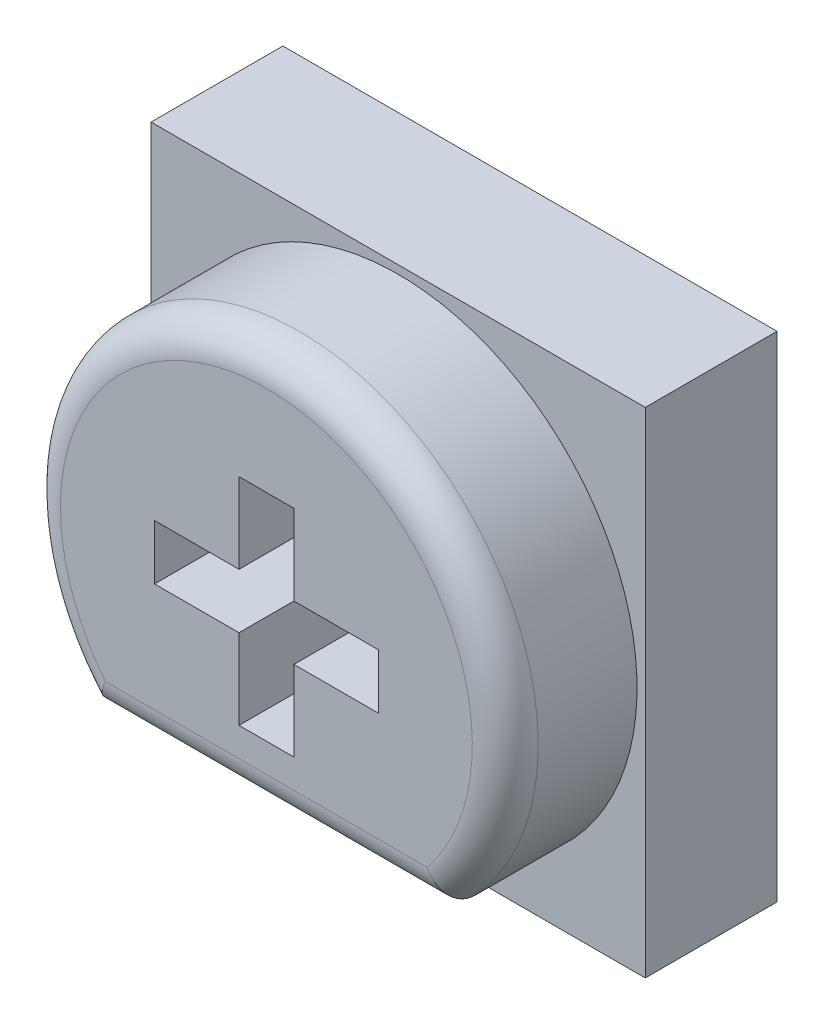
ISO-10303-21;
HEADER;
FILE_DESCRIPTION(('STEP AP214'),'2;1');
FILE_NAME('part.step','',(''),(''),'','','');
FILE_SCHEMA(('AUTOMOTIVE_DESIGN { 1 0 10303 214 1 1 1 1 }'));
ENDSEC;
DATA;
#1=APPLICATION_CONTEXT('core data for automotive mechanical design processes');
#2=APPLICATION_PROTOCOL_DEFINITION('international standard','automotive_design',2000,#1);
#3=PRODUCT_CONTEXT('',#1,'mechanical');
#4=PRODUCT('Part','Part','',(#3));
#5=PRODUCT_RELATED_PRODUCT_CATEGORY('part','',(#4));
#6=PRODUCT_DEFINITION_FORMATION('','',#4);
#7=PRODUCT_DEFINITION_CONTEXT('part definition',#1,'design');
#8=PRODUCT_DEFINITION('design','',#6,#7);
#9=PRODUCT_DEFINITION_SHAPE('','',#8);
#10=(LENGTH_UNIT() NAMED_UNIT(*) SI_UNIT(.MILLI.,.METRE.));
#11=(NAMED_UNIT(*) PLANE_ANGLE_UNIT() SI_UNIT($,.RADIAN.));
#12=(NAMED_UNIT(*) SI_UNIT($,.STERADIAN.) SOLID_ANGLE_UNIT());
#13=UNCERTAINTY_MEASURE_WITH_UNIT(LENGTH_MEASURE(1.E-05),#10,'distance_accuracy_value','');
#14=(GEOMETRIC_REPRESENTATION_CONTEXT(3) GLOBAL_UNCERTAINTY_ASSIGNED_CONTEXT((#13)) GLOBAL_UNIT_ASSIGNED_CONTEXT((#10,
#11,#12)) REPRESENTATION_CONTEXT('',''));
#15=CARTESIAN_POINT('',(0.,0.,0.));
#16=DIRECTION('',(0.,0.,1.));
#17=DIRECTION('',(1.,0.,0.));
#18=AXIS2_PLACEMENT_3D('',#15,#16,#17);
#19=CARTESIAN_POINT('',(0.,0.,1.6));
#20=DIRECTION('',(0.,0.,1.));
#21=DIRECTION('',(1.,0.,0.));
#22=AXIS2_PLACEMENT_3D('',#19,#20,#21);
#23=PLANE('',#22);
#24=CARTESIAN_POINT('',(0.,0.,1.6));
#25=DIRECTION('',(0.,0.,1.));
#26=DIRECTION('',(1.,0.,0.));
#27=AXIS2_PLACEMENT_3D('',#24,#25,#26);
#28=CIRCLE('',#27,1.25);
#29=CARTESIAN_POINT('',(0.976722388353635,-0.780072673594436,1.6));
#30=VERTEX_POINT('',#29);
#31=CARTESIAN_POINT('',(-0.976722388353635,-0.780072673594436,1.6));
#32=VERTEX_POINT('',#31);
#33=EDGE_CURVE('E267',#30,#32,#28,.T.);
#34=ORIENTED_EDGE('',*,*,#33,.T.);
#35=DIRECTION('',(1.,0.,0.));
#36=VECTOR('',#35,1.);
#37=CARTESIAN_POINT('',(1.06862414088005,-0.780072673595366,1.6));
#38=LINE('',#37,#36);
#39=EDGE_CURVE('E270',#32,#30,#38,.T.);
#40=ORIENTED_EDGE('',*,*,#39,.T.);
#41=EDGE_LOOP('',(#34,#40));
#42=FACE_BOUND('',#41,.T.);
#43=DIRECTION('',(0.,1.,0.));
#44=VECTOR('',#43,1.);
#45=CARTESIAN_POINT('',(-0.6790503810102,-0.117737433853022,1.6));
#46=LINE('',#45,#44);
#47=CARTESIAN_POINT('',(-0.6790503810102,-0.117737433853022,1.6));
#48=VERTEX_POINT('',#47);
#49=CARTESIAN_POINT('',(-0.6790503810102,0.215595899480311,1.6));
#50=VERTEX_POINT('',#49);
#51=EDGE_CURVE('E198',#48,#50,#46,.T.);
#52=ORIENTED_EDGE('',*,*,#51,.T.);
#53=DIRECTION('',(1.,0.,0.));
#54=VECTOR('',#53,1.);
#55=CARTESIAN_POINT('',(-0.6790503810102,0.215595899480311,1.6));
#56=LINE('',#55,#54);
#57=CARTESIAN_POINT('',(-0.166229868189687,0.215595899480311,1.6));
#58=VERTEX_POINT('',#57);
#59=EDGE_CURVE('E389',#50,#58,#56,.T.);
#60=ORIENTED_EDGE('',*,*,#59,.T.);
#61=DIRECTION('',(0.,1.,0.));
#62=VECTOR('',#61,1.);
#63=CARTESIAN_POINT('',(-0.166229868189687,0.215595899480311,1.6));
#64=LINE('',#63,#62);
#65=CARTESIAN_POINT('',(-0.166229868189687,0.702775386659798,1.6));
#66=VERTEX_POINT('',#65);
#67=EDGE_CURVE('E202',#58,#66,#64,.T.);
#68=ORIENTED_EDGE('',*,*,#67,.T.);
#69=DIRECTION('',(1.,0.,0.));
#70=VECTOR('',#69,1.);
#71=CARTESIAN_POINT('',(-0.166229868189687,0.702775386659798,1.6));
#72=LINE('',#71,#70);
#73=CARTESIAN_POINT('',(0.167103465143646,0.702775386659798,1.6));
#74=VERTEX_POINT('',#73);
#75=EDGE_CURVE('E394',#66,#74,#72,.T.);
#76=ORIENTED_EDGE('',*,*,#75,.T.);
#77=DIRECTION('',(0.,-1.,0.));
#78=VECTOR('',#77,1.);
#79=CARTESIAN_POINT('',(0.167103465143646,0.702775386659798,1.6));
#80=LINE('',#79,#78);
#81=CARTESIAN_POINT('',(0.167103465143646,0.215595899480311,1.6));
#82=VERTEX_POINT('',#81);
#83=EDGE_CURVE('E403',#74,#82,#80,.T.);
#84=ORIENTED_EDGE('',*,*,#83,.T.);
#85=DIRECTION('',(1.,0.,0.));
#86=VECTOR('',#85,1.);
#87=CARTESIAN_POINT('',(0.167103465143646,0.215595899480311,1.6));
#88=LINE('',#87,#86);
#89=CARTESIAN_POINT('',(0.679923977964159,0.215595899480311,1.6));
#90=VERTEX_POINT('',#89);
#91=EDGE_CURVE('E407',#82,#90,#88,.T.);
#92=ORIENTED_EDGE('',*,*,#91,.T.);
#93=DIRECTION('',(0.,-1.,0.));
#94=VECTOR('',#93,1.);
#95=CARTESIAN_POINT('',(0.679923977964159,0.215595899480311,1.6));
#96=LINE('',#95,#94);
#97=CARTESIAN_POINT('',(0.679923977964159,-0.117737433853022,1.6));
#98=VERTEX_POINT('',#97);
#99=EDGE_CURVE('E411',#90,#98,#96,.T.);
#100=ORIENTED_EDGE('',*,*,#99,.T.);
#101=DIRECTION('',(-1.,0.,0.));
#102=VECTOR('',#101,1.);
#103=CARTESIAN_POINT('',(0.679923977964159,-0.117737433853022,1.6));
#104=LINE('',#103,#102);
#105=CARTESIAN_POINT('',(0.167103465143646,-0.117737433853022,1.6));
#106=VERTEX_POINT('',#105);
#107=EDGE_CURVE('E415',#98,#106,#104,.T.);
#108=ORIENTED_EDGE('',*,*,#107,.T.);
#109=DIRECTION('',(0.,-1.,0.));
#110=VECTOR('',#109,1.);
#111=CARTESIAN_POINT('',(0.167103465143646,-0.117737433853022,1.6));
#112=LINE('',#111,#110);
#113=CARTESIAN_POINT('',(0.167103465143646,-0.60491692103251,1.6));
#114=VERTEX_POINT('',#113);
#115=EDGE_CURVE('E419',#106,#114,#112,.T.);
#116=ORIENTED_EDGE('',*,*,#115,.T.);
#117=DIRECTION('',(-1.,0.,0.));
#118=VECTOR('',#117,1.);
#119=CARTESIAN_POINT('',(0.167103465143646,-0.60491692103251,1.6));
#120=LINE('',#119,#118);
#121=CARTESIAN_POINT('',(-0.166229868189687,-0.60491692103251,1.6));
#122=VERTEX_POINT('',#121);
#123=EDGE_CURVE('E423',#114,#122,#120,.T.);
#124=ORIENTED_EDGE('',*,*,#123,.T.);
#125=DIRECTION('',(0.,1.,0.));
#126=VECTOR('',#125,1.);
#127=CARTESIAN_POINT('',(-0.166229868189687,-0.60491692103251,1.6));
#128=LINE('',#127,#126);
#129=CARTESIAN_POINT('',(-0.166229868189687,-0.117737433853022,1.6));
#130=VERTEX_POINT('',#129);
#131=EDGE_CURVE('E427',#122,#130,#128,.T.);
#132=ORIENTED_EDGE('',*,*,#131,.T.);
#133=DIRECTION('',(-1.,0.,0.));
#134=VECTOR('',#133,1.);
#135=CARTESIAN_POINT('',(-0.166229868189687,-0.117737433853022,1.6));
#136=LINE('',#135,#134);
#137=EDGE_CURVE('E431',#130,#48,#136,.T.);
#138=ORIENTED_EDGE('',*,*,#137,.T.);
#139=EDGE_LOOP('',(#52,#60,#68,#76,#84,#92,#100,#108,#116,#124,#132,#138));
#140=FACE_BOUND('',#139,.T.);
#141=ADVANCED_FACE('F39',(#42,#140),#23,.T.);
#142=CARTESIAN_POINT('',(1.5,1.5,0.8));
#143=DIRECTION('',(-1.,0.,0.));
#144=DIRECTION('',(0.,-1.,0.));
#145=AXIS2_PLACEMENT_3D('',#142,#143,#144);
#146=PLANE('',#145);
#147=DIRECTION('',(0.,1.,0.));
#148=VECTOR('',#147,1.);
#149=CARTESIAN_POINT('',(1.5,1.5,0.));
#150=LINE('',#149,#148);
#151=CARTESIAN_POINT('',(1.5,-1.5,0.));
#152=VERTEX_POINT('',#151);
#153=CARTESIAN_POINT('',(1.5,1.5,0.));
#154=VERTEX_POINT('',#153);
#155=EDGE_CURVE('E225',#152,#154,#150,.T.);
#156=ORIENTED_EDGE('',*,*,#155,.T.);
#157=DIRECTION('',(0.,0.,-1.));
#158=VECTOR('',#157,1.);
#159=CARTESIAN_POINT('',(1.5,1.5,0.8));
#160=LINE('',#159,#158);
#161=CARTESIAN_POINT('',(1.5,1.5,0.8));
#162=VERTEX_POINT('',#161);
#163=EDGE_CURVE('E263',#162,#154,#160,.T.);
#164=ORIENTED_EDGE('',*,*,#163,.F.);
#165=DIRECTION('',(0.,1.,0.));
#166=VECTOR('',#165,1.);
#167=CARTESIAN_POINT('',(1.5,1.5,0.8));
#168=LINE('',#167,#166);
#169=CARTESIAN_POINT('',(1.5,-1.5,0.8));
#170=VERTEX_POINT('',#169);
#171=EDGE_CURVE('E226',#170,#162,#168,.T.);
#172=ORIENTED_EDGE('',*,*,#171,.F.);
#173=DIRECTION('',(0.,0.,-1.));
#174=VECTOR('',#173,1.);
#175=CARTESIAN_POINT('',(1.5,-1.5,0.8));
#176=LINE('',#175,#174);
#177=EDGE_CURVE('E240',#170,#152,#176,.T.);
#178=ORIENTED_EDGE('',*,*,#177,.T.);
#179=EDGE_LOOP('',(#156,#164,#172,#178));
#180=FACE_BOUND('',#179,.T.);
#181=ADVANCED_FACE('F286',(#180),#146,.F.);
#182=CARTESIAN_POINT('',(-1.5,1.5,0.8));
#183=DIRECTION('',(0.,-1.,0.));
#184=DIRECTION('',(0.,0.,-1.));
#185=AXIS2_PLACEMENT_3D('',#182,#183,#184);
#186=PLANE('',#185);
#187=DIRECTION('',(-1.,0.,0.));
#188=VECTOR('',#187,1.);
#189=CARTESIAN_POINT('',(-1.5,1.5,0.));
#190=LINE('',#189,#188);
#191=CARTESIAN_POINT('',(-1.5,1.5,0.));
#192=VERTEX_POINT('',#191);
#193=EDGE_CURVE('E244',#154,#192,#190,.T.);
#194=ORIENTED_EDGE('',*,*,#193,.T.);
#195=DIRECTION('',(0.,0.,-1.));
#196=VECTOR('',#195,1.);
#197=CARTESIAN_POINT('',(-1.5,1.5,0.8));
#198=LINE('',#197,#196);
#199=CARTESIAN_POINT('',(-1.5,1.5,0.8));
#200=VERTEX_POINT('',#199);
#201=EDGE_CURVE('E259',#200,#192,#198,.T.);
#202=ORIENTED_EDGE('',*,*,#201,.F.);
#203=DIRECTION('',(-1.,0.,0.));
#204=VECTOR('',#203,1.);
#205=CARTESIAN_POINT('',(-1.5,1.5,0.8));
#206=LINE('',#205,#204);
#207=EDGE_CURVE('E230',#162,#200,#206,.T.);
#208=ORIENTED_EDGE('',*,*,#207,.F.);
#209=ORIENTED_EDGE('',*,*,#163,.T.);
#210=EDGE_LOOP('',(#194,#202,#208,#209));
#211=FACE_BOUND('',#210,.T.);
#212=ADVANCED_FACE('F290',(#211),#186,.F.);
#213=CARTESIAN_POINT('',(-1.5,1.5,0.8));
#214=DIRECTION('',(1.,0.,0.));
#215=DIRECTION('',(0.,1.,0.));
#216=AXIS2_PLACEMENT_3D('',#213,#214,#215);
#217=PLANE('',#216);
#218=DIRECTION('',(0.,-1.,0.));
#219=VECTOR('',#218,1.);
#220=CARTESIAN_POINT('',(-1.5,1.5,0.));
#221=LINE('',#220,#219);
#222=CARTESIAN_POINT('',(-1.5,-1.5,0.));
#223=VERTEX_POINT('',#222);
#224=EDGE_CURVE('E247',#192,#223,#221,.T.);
#225=ORIENTED_EDGE('',*,*,#224,.T.);
#226=DIRECTION('',(0.,0.,-1.));
#227=VECTOR('',#226,1.);
#228=CARTESIAN_POINT('',(-1.5,-1.5,0.8));
#229=LINE('',#228,#227);
#230=CARTESIAN_POINT('',(-1.5,-1.5,0.8));
#231=VERTEX_POINT('',#230);
#232=EDGE_CURVE('E255',#231,#223,#229,.T.);
#233=ORIENTED_EDGE('',*,*,#232,.F.);
#234=DIRECTION('',(0.,-1.,0.));
#235=VECTOR('',#234,1.);
#236=CARTESIAN_POINT('',(-1.5,1.5,0.8));
#237=LINE('',#236,#235);
#238=EDGE_CURVE('E234',#200,#231,#237,.T.);
#239=ORIENTED_EDGE('',*,*,#238,.F.);
#240=ORIENTED_EDGE('',*,*,#201,.T.);
#241=EDGE_LOOP('',(#225,#233,#239,#240));
#242=FACE_BOUND('',#241,.T.);
#243=ADVANCED_FACE('F294',(#242),#217,.F.);
#244=CARTESIAN_POINT('',(-1.5,-1.5,0.8));
#245=DIRECTION('',(0.,1.,0.));
#246=DIRECTION('',(0.,0.,1.));
#247=AXIS2_PLACEMENT_3D('',#244,#245,#246);
#248=PLANE('',#247);
#249=DIRECTION('',(1.,0.,0.));
#250=VECTOR('',#249,1.);
#251=CARTESIAN_POINT('',(-1.5,-1.5,0.));
#252=LINE('',#251,#250);
#253=EDGE_CURVE('E231',#223,#152,#252,.T.);
#254=ORIENTED_EDGE('',*,*,#253,.T.);
#255=ORIENTED_EDGE('',*,*,#177,.F.);
#256=DIRECTION('',(1.,0.,0.));
#257=VECTOR('',#256,1.);
#258=CARTESIAN_POINT('',(-1.5,-1.5,0.8));
#259=LINE('',#258,#257);
#260=EDGE_CURVE('E237',#231,#170,#259,.T.);
#261=ORIENTED_EDGE('',*,*,#260,.F.);
#262=ORIENTED_EDGE('',*,*,#232,.T.);
#263=EDGE_LOOP('',(#254,#255,#261,#262));
#264=FACE_BOUND('',#263,.T.);
#265=ADVANCED_FACE('F298',(#264),#248,.F.);
#266=CARTESIAN_POINT('',(0.,0.,0.8));
#267=DIRECTION('',(0.,0.,1.));
#268=DIRECTION('',(1.,0.,0.));
#269=AXIS2_PLACEMENT_3D('',#266,#267,#268);
#270=PLANE('',#269);
#271=CARTESIAN_POINT('',(0.,0.,0.8));
#272=DIRECTION('',(0.,0.,1.));
#273=DIRECTION('',(1.,0.,0.));
#274=AXIS2_PLACEMENT_3D('',#271,#272,#273);
#275=CIRCLE('',#274,1.45);
#276=CARTESIAN_POINT('',(1.06862414088005,-0.980072673595366,0.8));
#277=VERTEX_POINT('',#276);
#278=CARTESIAN_POINT('',(-1.06862414088005,-0.980072673595366,0.8));
#279=VERTEX_POINT('',#278);
#280=EDGE_CURVE('E204',#277,#279,#275,.T.);
#281=ORIENTED_EDGE('',*,*,#280,.F.);
#282=DIRECTION('',(1.,0.,0.));
#283=VECTOR('',#282,1.);
#284=CARTESIAN_POINT('',(-1.06862414088005,-0.980072673595366,0.8));
#285=LINE('',#284,#283);
#286=EDGE_CURVE('E210',#279,#277,#285,.T.);
#287=ORIENTED_EDGE('',*,*,#286,.F.);
#288=EDGE_LOOP('',(#281,#287));
#289=FACE_BOUND('',#288,.T.);
#290=ORIENTED_EDGE('',*,*,#171,.T.);
#291=ORIENTED_EDGE('',*,*,#207,.T.);
#292=ORIENTED_EDGE('',*,*,#238,.T.);
#293=ORIENTED_EDGE('',*,*,#260,.T.);
#294=EDGE_LOOP('',(#290,#291,#292,#293));
#295=FACE_BOUND('',#294,.T.);
#296=ADVANCED_FACE('F302',(#289,#295),#270,.T.);
#297=CARTESIAN_POINT('',(0.,0.,0.));
#298=DIRECTION('',(0.,0.,1.));
#299=DIRECTION('',(1.,0.,0.));
#300=AXIS2_PLACEMENT_3D('',#297,#298,#299);
#301=PLANE('',#300);
#302=ORIENTED_EDGE('',*,*,#155,.F.);
#303=ORIENTED_EDGE('',*,*,#253,.F.);
#304=ORIENTED_EDGE('',*,*,#224,.F.);
#305=ORIENTED_EDGE('',*,*,#193,.F.);
#306=EDGE_LOOP('',(#302,#303,#304,#305));
#307=FACE_BOUND('',#306,.T.);
#308=ADVANCED_FACE('F304',(#307),#301,.F.);
#309=CARTESIAN_POINT('',(0.,0.,1.6));
#310=DIRECTION('',(0.,0.,-1.));
#311=DIRECTION('',(-1.,0.,0.));
#312=AXIS2_PLACEMENT_3D('',#309,#310,#311);
#313=CYLINDRICAL_SURFACE('',#312,1.45);
#314=DIRECTION('',(0.,0.,-1.));
#315=VECTOR('',#314,1.);
#316=CARTESIAN_POINT('',(-1.06862414088005,-0.980072673595366,1.6));
#317=LINE('',#316,#315);
#318=CARTESIAN_POINT('',(-1.06862414088005,-0.980072673595366,1.4));
#319=VERTEX_POINT('',#318);
#320=EDGE_CURVE('E222',#319,#279,#317,.T.);
#321=ORIENTED_EDGE('',*,*,#320,.F.);
#322=CARTESIAN_POINT('',(0.,0.,1.4));
#323=DIRECTION('',(0.,0.,1.));
#324=DIRECTION('',(1.,0.,0.));
#325=AXIS2_PLACEMENT_3D('',#322,#323,#324);
#326=CIRCLE('',#325,1.45);
#327=CARTESIAN_POINT('',(1.06862414088005,-0.980072673595366,1.4));
#328=VERTEX_POINT('',#327);
#329=EDGE_CURVE('E11',#319,#328,#326,.F.);
#330=ORIENTED_EDGE('',*,*,#329,.T.);
#331=DIRECTION('',(0.,0.,-1.));
#332=VECTOR('',#331,1.);
#333=CARTESIAN_POINT('',(1.06862414088005,-0.980072673595366,1.6));
#334=LINE('',#333,#332);
#335=EDGE_CURVE('E219',#328,#277,#334,.T.);
#336=ORIENTED_EDGE('',*,*,#335,.T.);
#337=ORIENTED_EDGE('',*,*,#280,.T.);
#338=EDGE_LOOP('',(#321,#330,#336,#337));
#339=FACE_BOUND('',#338,.T.);
#340=ADVANCED_FACE('F307',(#339),#313,.T.);
#341=CARTESIAN_POINT('',(-1.06862414088005,-0.980072673595366,1.6));
#342=DIRECTION('',(0.,1.,0.));
#343=DIRECTION('',(0.,0.,1.));
#344=AXIS2_PLACEMENT_3D('',#341,#342,#343);
#345=PLANE('',#344);
#346=ORIENTED_EDGE('',*,*,#335,.F.);
#347=DIRECTION('',(1.,0.,0.));
#348=VECTOR('',#347,1.);
#349=CARTESIAN_POINT('',(-1.06862414088005,-0.980072673595366,1.4));
#350=LINE('',#349,#348);
#351=EDGE_CURVE('E54',#328,#319,#350,.F.);
#352=ORIENTED_EDGE('',*,*,#351,.T.);
#353=ORIENTED_EDGE('',*,*,#320,.T.);
#354=ORIENTED_EDGE('',*,*,#286,.T.);
#355=EDGE_LOOP('',(#346,#352,#353,#354));
#356=FACE_BOUND('',#355,.T.);
#357=ADVANCED_FACE('F314',(#356),#345,.F.);
#358=CARTESIAN_POINT('',(-0.6790503810102,0.215595899480311,0.8));
#359=DIRECTION('',(0.,-1.,0.));
#360=DIRECTION('',(0.,0.,-1.));
#361=AXIS2_PLACEMENT_3D('',#358,#359,#360);
#362=PLANE('',#361);
#363=ORIENTED_EDGE('',*,*,#59,.F.);
#364=DIRECTION('',(0.,0.,1.));
#365=VECTOR('',#364,1.);
#366=CARTESIAN_POINT('',(-0.6790503810102,0.215595899480311,0.8));
#367=LINE('',#366,#365);
#368=CARTESIAN_POINT('',(-0.6790503810102,0.215595899480311,0.8));
#369=VERTEX_POINT('',#368);
#370=EDGE_CURVE('E196',#369,#50,#367,.T.);
#371=ORIENTED_EDGE('',*,*,#370,.F.);
#372=DIRECTION('',(1.,0.,0.));
#373=VECTOR('',#372,1.);
#374=CARTESIAN_POINT('',(-0.6790503810102,0.215595899480311,0.8));
#375=LINE('',#374,#373);
#376=CARTESIAN_POINT('',(-0.166229868189687,0.215595899480311,0.8));
#377=VERTEX_POINT('',#376);
#378=EDGE_CURVE('E181',#369,#377,#375,.T.);
#379=ORIENTED_EDGE('',*,*,#378,.T.);
#380=DIRECTION('',(0.,0.,1.));
#381=VECTOR('',#380,1.);
#382=CARTESIAN_POINT('',(-0.166229868189687,0.215595899480311,0.8));
#383=LINE('',#382,#381);
#384=EDGE_CURVE('E193',#377,#58,#383,.T.);
#385=ORIENTED_EDGE('',*,*,#384,.T.);
#386=EDGE_LOOP('',(#363,#371,#379,#385));
#387=FACE_BOUND('',#386,.T.);
#388=ADVANCED_FACE('F192',(#387),#362,.T.);
#389=CARTESIAN_POINT('',(-0.166229868189687,0.215595899480311,0.8));
#390=DIRECTION('',(1.,0.,0.));
#391=DIRECTION('',(0.,0.,-1.));
#392=AXIS2_PLACEMENT_3D('',#389,#390,#391);
#393=PLANE('',#392);
#394=ORIENTED_EDGE('',*,*,#67,.F.);
#395=ORIENTED_EDGE('',*,*,#384,.F.);
#396=DIRECTION('',(0.,1.,0.));
#397=VECTOR('',#396,1.);
#398=CARTESIAN_POINT('',(-0.166229868189687,0.215595899480311,0.8));
#399=LINE('',#398,#397);
#400=CARTESIAN_POINT('',(-0.166229868189687,0.702775386659798,0.8));
#401=VERTEX_POINT('',#400);
#402=EDGE_CURVE('E177',#377,#401,#399,.T.);
#403=ORIENTED_EDGE('',*,*,#402,.T.);
#404=DIRECTION('',(0.,0.,1.));
#405=VECTOR('',#404,1.);
#406=CARTESIAN_POINT('',(-0.166229868189687,0.702775386659798,0.8));
#407=LINE('',#406,#405);
#408=EDGE_CURVE('E205',#401,#66,#407,.T.);
#409=ORIENTED_EDGE('',*,*,#408,.T.);
#410=EDGE_LOOP('',(#394,#395,#403,#409));
#411=FACE_BOUND('',#410,.T.);
#412=ADVANCED_FACE('F200',(#411),#393,.T.);
#413=CARTESIAN_POINT('',(-0.166229868189687,0.702775386659798,0.8));
#414=DIRECTION('',(0.,-1.,0.));
#415=DIRECTION('',(0.,0.,-1.));
#416=AXIS2_PLACEMENT_3D('',#413,#414,#415);
#417=PLANE('',#416);
#418=ORIENTED_EDGE('',*,*,#75,.F.);
#419=ORIENTED_EDGE('',*,*,#408,.F.);
#420=DIRECTION('',(1.,0.,0.));
#421=VECTOR('',#420,1.);
#422=CARTESIAN_POINT('',(-0.166229868189687,0.702775386659798,0.8));
#423=LINE('',#422,#421);
#424=CARTESIAN_POINT('',(0.167103465143646,0.702775386659798,0.8));
#425=VERTEX_POINT('',#424);
#426=EDGE_CURVE('E183',#401,#425,#423,.T.);
#427=ORIENTED_EDGE('',*,*,#426,.T.);
#428=DIRECTION('',(0.,0.,1.));
#429=VECTOR('',#428,1.);
#430=CARTESIAN_POINT('',(0.167103465143646,0.702775386659798,0.8));
#431=LINE('',#430,#429);
#432=EDGE_CURVE('E212',#425,#74,#431,.T.);
#433=ORIENTED_EDGE('',*,*,#432,.T.);
#434=EDGE_LOOP('',(#418,#419,#427,#433));
#435=FACE_BOUND('',#434,.T.);
#436=ADVANCED_FACE('F325',(#435),#417,.T.);
#437=CARTESIAN_POINT('',(0.167103465143646,0.702775386659798,0.8));
#438=DIRECTION('',(-1.,0.,0.));
#439=DIRECTION('',(0.,0.,1.));
#440=AXIS2_PLACEMENT_3D('',#437,#438,#439);
#441=PLANE('',#440);
#442=ORIENTED_EDGE('',*,*,#83,.F.);
#443=ORIENTED_EDGE('',*,*,#432,.F.);
#444=DIRECTION('',(0.,-1.,0.));
#445=VECTOR('',#444,1.);
#446=CARTESIAN_POINT('',(0.167103465143646,0.702775386659798,0.8));
#447=LINE('',#446,#445);
#448=CARTESIAN_POINT('',(0.167103465143646,0.215595899480311,0.8));
#449=VERTEX_POINT('',#448);
#450=EDGE_CURVE('E495',#425,#449,#447,.T.);
#451=ORIENTED_EDGE('',*,*,#450,.T.);
#452=DIRECTION('',(0.,0.,1.));
#453=VECTOR('',#452,1.);
#454=CARTESIAN_POINT('',(0.167103465143646,0.215595899480311,0.8));
#455=LINE('',#454,#453);
#456=EDGE_CURVE('E460',#449,#82,#455,.T.);
#457=ORIENTED_EDGE('',*,*,#456,.T.);
#458=EDGE_LOOP('',(#442,#443,#451,#457));
#459=FACE_BOUND('',#458,.T.);
#460=ADVANCED_FACE('F328',(#459),#441,.T.);
#461=CARTESIAN_POINT('',(0.167103465143646,0.215595899480311,0.8));
#462=DIRECTION('',(0.,-1.,0.));
#463=DIRECTION('',(0.,0.,-1.));
#464=AXIS2_PLACEMENT_3D('',#461,#462,#463);
#465=PLANE('',#464);
#466=ORIENTED_EDGE('',*,*,#91,.F.);
#467=ORIENTED_EDGE('',*,*,#456,.F.);
#468=DIRECTION('',(1.,0.,0.));
#469=VECTOR('',#468,1.);
#470=CARTESIAN_POINT('',(0.167103465143646,0.215595899480311,0.8));
#471=LINE('',#470,#469);
#472=CARTESIAN_POINT('',(0.679923977964159,0.215595899480311,0.8));
#473=VERTEX_POINT('',#472);
#474=EDGE_CURVE('E492',#449,#473,#471,.T.);
#475=ORIENTED_EDGE('',*,*,#474,.T.);
#476=DIRECTION('',(0.,0.,1.));
#477=VECTOR('',#476,1.);
#478=CARTESIAN_POINT('',(0.679923977964159,0.215595899480311,0.8));
#479=LINE('',#478,#477);
#480=EDGE_CURVE('E457',#473,#90,#479,.T.);
#481=ORIENTED_EDGE('',*,*,#480,.T.);
#482=EDGE_LOOP('',(#466,#467,#475,#481));
#483=FACE_BOUND('',#482,.T.);
#484=ADVANCED_FACE('F332',(#483),#465,.T.);
#485=CARTESIAN_POINT('',(0.679923977964159,0.215595899480311,0.8));
#486=DIRECTION('',(-1.,0.,0.));
#487=DIRECTION('',(0.,0.,1.));
#488=AXIS2_PLACEMENT_3D('',#485,#486,#487);
#489=PLANE('',#488);
#490=ORIENTED_EDGE('',*,*,#99,.F.);
#491=ORIENTED_EDGE('',*,*,#480,.F.);
#492=DIRECTION('',(0.,-1.,0.));
#493=VECTOR('',#492,1.);
#494=CARTESIAN_POINT('',(0.679923977964159,0.215595899480311,0.8));
#495=LINE('',#494,#493);
#496=CARTESIAN_POINT('',(0.679923977964159,-0.117737433853022,0.8));
#497=VERTEX_POINT('',#496);
#498=EDGE_CURVE('E489',#473,#497,#495,.T.);
#499=ORIENTED_EDGE('',*,*,#498,.T.);
#500=DIRECTION('',(0.,0.,1.));
#501=VECTOR('',#500,1.);
#502=CARTESIAN_POINT('',(0.679923977964159,-0.117737433853022,0.8));
#503=LINE('',#502,#501);
#504=EDGE_CURVE('E454',#497,#98,#503,.T.);
#505=ORIENTED_EDGE('',*,*,#504,.T.);
#506=EDGE_LOOP('',(#490,#491,#499,#505));
#507=FACE_BOUND('',#506,.T.);
#508=ADVANCED_FACE('F336',(#507),#489,.T.);
#509=CARTESIAN_POINT('',(0.679923977964159,-0.117737433853022,0.8));
#510=DIRECTION('',(0.,1.,0.));
#511=DIRECTION('',(0.,0.,1.));
#512=AXIS2_PLACEMENT_3D('',#509,#510,#511);
#513=PLANE('',#512);
#514=ORIENTED_EDGE('',*,*,#107,.F.);
#515=ORIENTED_EDGE('',*,*,#504,.F.);
#516=DIRECTION('',(-1.,0.,0.));
#517=VECTOR('',#516,1.);
#518=CARTESIAN_POINT('',(0.679923977964159,-0.117737433853022,0.8));
#519=LINE('',#518,#517);
#520=CARTESIAN_POINT('',(0.167103465143646,-0.117737433853022,0.8));
#521=VERTEX_POINT('',#520);
#522=EDGE_CURVE('E486',#497,#521,#519,.T.);
#523=ORIENTED_EDGE('',*,*,#522,.T.);
#524=DIRECTION('',(0.,0.,1.));
#525=VECTOR('',#524,1.);
#526=CARTESIAN_POINT('',(0.167103465143646,-0.117737433853022,0.8));
#527=LINE('',#526,#525);
#528=EDGE_CURVE('E451',#521,#106,#527,.T.);
#529=ORIENTED_EDGE('',*,*,#528,.T.);
#530=EDGE_LOOP('',(#514,#515,#523,#529));
#531=FACE_BOUND('',#530,.T.);
#532=ADVANCED_FACE('F340',(#531),#513,.T.);
#533=CARTESIAN_POINT('',(0.167103465143646,-0.117737433853022,0.8));
#534=DIRECTION('',(-1.,0.,0.));
#535=DIRECTION('',(0.,0.,1.));
#536=AXIS2_PLACEMENT_3D('',#533,#534,#535);
#537=PLANE('',#536);
#538=ORIENTED_EDGE('',*,*,#115,.F.);
#539=ORIENTED_EDGE('',*,*,#528,.F.);
#540=DIRECTION('',(0.,-1.,0.));
#541=VECTOR('',#540,1.);
#542=CARTESIAN_POINT('',(0.167103465143646,-0.117737433853022,0.8));
#543=LINE('',#542,#541);
#544=CARTESIAN_POINT('',(0.167103465143646,-0.60491692103251,0.8));
#545=VERTEX_POINT('',#544);
#546=EDGE_CURVE('E483',#521,#545,#543,.T.);
#547=ORIENTED_EDGE('',*,*,#546,.T.);
#548=DIRECTION('',(0.,0.,1.));
#549=VECTOR('',#548,1.);
#550=CARTESIAN_POINT('',(0.167103465143646,-0.60491692103251,0.8));
#551=LINE('',#550,#549);
#552=EDGE_CURVE('E448',#545,#114,#551,.T.);
#553=ORIENTED_EDGE('',*,*,#552,.T.);
#554=EDGE_LOOP('',(#538,#539,#547,#553));
#555=FACE_BOUND('',#554,.T.);
#556=ADVANCED_FACE('F344',(#555),#537,.T.);
#557=CARTESIAN_POINT('',(0.167103465143646,-0.60491692103251,0.8));
#558=DIRECTION('',(0.,1.,0.));
#559=DIRECTION('',(0.,0.,1.));
#560=AXIS2_PLACEMENT_3D('',#557,#558,#559);
#561=PLANE('',#560);
#562=ORIENTED_EDGE('',*,*,#123,.F.);
#563=ORIENTED_EDGE('',*,*,#552,.F.);
#564=DIRECTION('',(-1.,0.,0.));
#565=VECTOR('',#564,1.);
#566=CARTESIAN_POINT('',(0.167103465143646,-0.60491692103251,0.8));
#567=LINE('',#566,#565);
#568=CARTESIAN_POINT('',(-0.166229868189687,-0.60491692103251,0.8));
#569=VERTEX_POINT('',#568);
#570=EDGE_CURVE('E478',#545,#569,#567,.T.);
#571=ORIENTED_EDGE('',*,*,#570,.T.);
#572=DIRECTION('',(0.,0.,1.));
#573=VECTOR('',#572,1.);
#574=CARTESIAN_POINT('',(-0.166229868189687,-0.60491692103251,0.8));
#575=LINE('',#574,#573);
#576=EDGE_CURVE('E445',#569,#122,#575,.T.);
#577=ORIENTED_EDGE('',*,*,#576,.T.);
#578=EDGE_LOOP('',(#562,#563,#571,#577));
#579=FACE_BOUND('',#578,.T.);
#580=ADVANCED_FACE('F348',(#579),#561,.T.);
#581=CARTESIAN_POINT('',(-0.166229868189687,-0.60491692103251,0.8));
#582=DIRECTION('',(1.,0.,0.));
#583=DIRECTION('',(0.,0.,-1.));
#584=AXIS2_PLACEMENT_3D('',#581,#582,#583);
#585=PLANE('',#584);
#586=ORIENTED_EDGE('',*,*,#131,.F.);
#587=ORIENTED_EDGE('',*,*,#576,.F.);
#588=DIRECTION('',(0.,1.,0.));
#589=VECTOR('',#588,1.);
#590=CARTESIAN_POINT('',(-0.166229868189687,-0.60491692103251,0.8));
#591=LINE('',#590,#589);
#592=CARTESIAN_POINT('',(-0.166229868189687,-0.117737433853022,0.8));
#593=VERTEX_POINT('',#592);
#594=EDGE_CURVE('E475',#569,#593,#591,.T.);
#595=ORIENTED_EDGE('',*,*,#594,.T.);
#596=DIRECTION('',(0.,0.,1.));
#597=VECTOR('',#596,1.);
#598=CARTESIAN_POINT('',(-0.166229868189687,-0.117737433853022,0.8));
#599=LINE('',#598,#597);
#600=EDGE_CURVE('E442',#593,#130,#599,.T.);
#601=ORIENTED_EDGE('',*,*,#600,.T.);
#602=EDGE_LOOP('',(#586,#587,#595,#601));
#603=FACE_BOUND('',#602,.T.);
#604=ADVANCED_FACE('F352',(#603),#585,.T.);
#605=CARTESIAN_POINT('',(-0.166229868189687,-0.117737433853022,0.8));
#606=DIRECTION('',(0.,1.,0.));
#607=DIRECTION('',(0.,0.,1.));
#608=AXIS2_PLACEMENT_3D('',#605,#606,#607);
#609=PLANE('',#608);
#610=ORIENTED_EDGE('',*,*,#137,.F.);
#611=ORIENTED_EDGE('',*,*,#600,.F.);
#612=DIRECTION('',(-1.,0.,0.));
#613=VECTOR('',#612,1.);
#614=CARTESIAN_POINT('',(-0.166229868189687,-0.117737433853022,0.8));
#615=LINE('',#614,#613);
#616=CARTESIAN_POINT('',(-0.6790503810102,-0.117737433853022,0.8));
#617=VERTEX_POINT('',#616);
#618=EDGE_CURVE('E473',#593,#617,#615,.T.);
#619=ORIENTED_EDGE('',*,*,#618,.T.);
#620=DIRECTION('',(0.,0.,1.));
#621=VECTOR('',#620,1.);
#622=CARTESIAN_POINT('',(-0.6790503810102,-0.117737433853022,0.8));
#623=LINE('',#622,#621);
#624=EDGE_CURVE('E439',#617,#48,#623,.T.);
#625=ORIENTED_EDGE('',*,*,#624,.T.);
#626=EDGE_LOOP('',(#610,#611,#619,#625));
#627=FACE_BOUND('',#626,.T.);
#628=ADVANCED_FACE('F356',(#627),#609,.T.);
#629=CARTESIAN_POINT('',(-0.6790503810102,-0.117737433853022,0.8));
#630=DIRECTION('',(1.,0.,0.));
#631=DIRECTION('',(0.,0.,-1.));
#632=AXIS2_PLACEMENT_3D('',#629,#630,#631);
#633=PLANE('',#632);
#634=ORIENTED_EDGE('',*,*,#51,.F.);
#635=ORIENTED_EDGE('',*,*,#624,.F.);
#636=DIRECTION('',(0.,1.,0.));
#637=VECTOR('',#636,1.);
#638=CARTESIAN_POINT('',(-0.6790503810102,-0.117737433853022,0.8));
#639=LINE('',#638,#637);
#640=EDGE_CURVE('E397',#617,#369,#639,.T.);
#641=ORIENTED_EDGE('',*,*,#640,.T.);
#642=ORIENTED_EDGE('',*,*,#370,.T.);
#643=EDGE_LOOP('',(#634,#635,#641,#642));
#644=FACE_BOUND('',#643,.T.);
#645=ADVANCED_FACE('F360',(#644),#633,.T.);
#646=CARTESIAN_POINT('',(0.,0.,0.8));
#647=DIRECTION('',(0.,0.,1.));
#648=DIRECTION('',(1.,0.,0.));
#649=AXIS2_PLACEMENT_3D('',#646,#647,#648);
#650=PLANE('',#649);
#651=ORIENTED_EDGE('',*,*,#378,.F.);
#652=ORIENTED_EDGE('',*,*,#640,.F.);
#653=ORIENTED_EDGE('',*,*,#618,.F.);
#654=ORIENTED_EDGE('',*,*,#594,.F.);
#655=ORIENTED_EDGE('',*,*,#570,.F.);
#656=ORIENTED_EDGE('',*,*,#546,.F.);
#657=ORIENTED_EDGE('',*,*,#522,.F.);
#658=ORIENTED_EDGE('',*,*,#498,.F.);
#659=ORIENTED_EDGE('',*,*,#474,.F.);
#660=ORIENTED_EDGE('',*,*,#450,.F.);
#661=ORIENTED_EDGE('',*,*,#426,.F.);
#662=ORIENTED_EDGE('',*,*,#402,.F.);
#663=EDGE_LOOP('',(#651,#652,#653,#654,#655,#656,#657,#658,#659,#660,#661,#662));
#664=FACE_BOUND('',#663,.T.);
#665=ADVANCED_FACE('F179',(#664),#650,.T.);
#666=CARTESIAN_POINT('',(0.,0.,1.4));
#667=DIRECTION('',(0.,0.,1.));
#668=DIRECTION('',(1.,0.,0.));
#669=AXIS2_PLACEMENT_3D('',#666,#667,#668);
#670=TOROIDAL_SURFACE('',#669,1.25,0.2);
#671=CARTESIAN_POINT('',(1.06862414088005,-0.980072673595366,1.4));
#672=CARTESIAN_POINT('',(1.06862877738244,-0.980084892656286,1.41055385822671));
#673=CARTESIAN_POINT('',(1.06825714892109,-0.979238140761556,1.42109973093428));
#674=CARTESIAN_POINT('',(1.0667979997634,-0.975922535779073,1.44185182536485));
#675=CARTESIAN_POINT('',(1.06571258083091,-0.973458445003825,1.45205895212045));
#676=CARTESIAN_POINT('',(1.06286253644352,-0.967003971439888,1.47187218442056));
#677=CARTESIAN_POINT('',(1.06109811629514,-0.963014050011971,1.4814784706188));
#678=CARTESIAN_POINT('',(1.05695043410757,-0.953666833543092,1.4998566095634));
#679=CARTESIAN_POINT('',(1.05456692361638,-0.948308989545124,1.50862812536595));
#680=CARTESIAN_POINT('',(1.04916628474931,-0.936219978493928,1.52541327952572));
#681=CARTESIAN_POINT('',(1.04613099359213,-0.929449649694686,1.53339277789823));
#682=CARTESIAN_POINT('',(1.03956404251412,-0.914876494174229,1.54810549003463));
#683=CARTESIAN_POINT('',(1.03603222660289,-0.907073343022253,1.55483831059053));
#684=CARTESIAN_POINT('',(1.02826113795755,-0.89000252965373,1.56744199038934));
#685=CARTESIAN_POINT('',(1.02398786215229,-0.880667631335978,1.57320066417882));
#686=CARTESIAN_POINT('',(1.01507279336763,-0.861325973056358,1.58307340363904));
#687=CARTESIAN_POINT('',(1.01043083126259,-0.851318905082025,1.58718670925465));
#688=CARTESIAN_POINT('',(1.00123376635672,-0.831636837022603,1.59349452016646));
#689=CARTESIAN_POINT('',(0.996696835984622,-0.821990496087636,1.59580667655096));
#690=CARTESIAN_POINT('',(0.987484892183164,-0.802542804162716,1.59897705190524));
#691=CARTESIAN_POINT('',(0.982810151767205,-0.792741775458933,1.59983797170362));
#692=CARTESIAN_POINT('',(0.977646941357499,-0.781994992269259,1.59999308573319));
#693=CARTESIAN_POINT('',(0.977184770979174,-0.781033708907868,1.60000001513914));
#694=CARTESIAN_POINT('',(0.976722388352892,-0.780072673595366,1.6));
#695=B_SPLINE_CURVE_WITH_KNOTS('',3,(#671,#672,#673,#674,#675,#676,#677,#678,#679,#680,#681,
#682,#683,#684,#685,#686,#687,#688,#689,#690,#691,#692,#693,#694),.UNSPECIFIED.,.F.,.F.,(4,2,2,
2,2,2,2,2,2,2,2,4),(0.,0.0316087378156171,0.0631248176054801,0.0946313754991534,
0.126150597126021,0.158699978796571,0.19125960927107,0.22642633498686,0.261609286778809,
0.294237252545277,0.326804428615449,0.330004234356813),.UNSPECIFIED.);
#696=EDGE_CURVE('E276',#328,#30,#695,.T.);
#697=ORIENTED_EDGE('',*,*,#696,.F.);
#698=ORIENTED_EDGE('',*,*,#329,.F.);
#699=CARTESIAN_POINT('',(-1.06862414088005,-0.980072673595366,1.4));
#700=CARTESIAN_POINT('',(-1.06862877738244,-0.980084892656286,1.41055385822671));
#701=CARTESIAN_POINT('',(-1.06825714892109,-0.979238140761556,1.42109973093428));
#702=CARTESIAN_POINT('',(-1.0667979997634,-0.975922535779073,1.44185182536485));
#703=CARTESIAN_POINT('',(-1.06571258083091,-0.973458445003825,1.45205895212045));
#704=CARTESIAN_POINT('',(-1.06286253644352,-0.967003971439888,1.47187218442056));
#705=CARTESIAN_POINT('',(-1.06109811629514,-0.963014050011971,1.4814784706188));
#706=CARTESIAN_POINT('',(-1.05695043410757,-0.953666833543092,1.4998566095634));
#707=CARTESIAN_POINT('',(-1.05456692361638,-0.948308989545124,1.50862812536595));
#708=CARTESIAN_POINT('',(-1.04916628474931,-0.936219978493928,1.52541327952572));
#709=CARTESIAN_POINT('',(-1.04613099359213,-0.929449649694686,1.53339277789823));
#710=CARTESIAN_POINT('',(-1.03956404251412,-0.914876494174229,1.54810549003463));
#711=CARTESIAN_POINT('',(-1.03603222660289,-0.907073343022253,1.55483831059053));
#712=CARTESIAN_POINT('',(-1.02826113795755,-0.89000252965373,1.56744199038934));
#713=CARTESIAN_POINT('',(-1.02398786215229,-0.880667631335978,1.57320066417882));
#714=CARTESIAN_POINT('',(-1.01507279336763,-0.861325973056358,1.58307340363904));
#715=CARTESIAN_POINT('',(-1.01043083126259,-0.851318905082025,1.58718670925465));
#716=CARTESIAN_POINT('',(-1.00123376635672,-0.831636837022603,1.59349452016646));
#717=CARTESIAN_POINT('',(-0.996696835984622,-0.821990496087636,1.59580667655096));
#718=CARTESIAN_POINT('',(-0.987484892183164,-0.802542804162716,1.59897705190524));
#719=CARTESIAN_POINT('',(-0.982810151767205,-0.792741775458933,1.59983797170362));
#720=CARTESIAN_POINT('',(-0.977646941357499,-0.781994992269259,1.59999308573319));
#721=CARTESIAN_POINT('',(-0.977184770979174,-0.781033708907868,1.60000001513914));
#722=CARTESIAN_POINT('',(-0.976722388352892,-0.780072673595366,1.6));
#723=B_SPLINE_CURVE_WITH_KNOTS('',3,(#699,#700,#701,#702,#703,#704,#705,#706,#707,#708,#709,
#710,#711,#712,#713,#714,#715,#716,#717,#718,#719,#720,#721,#722),.UNSPECIFIED.,.F.,.F.,(4,2,2,
2,2,2,2,2,2,2,2,4),(0.,0.0316087378156171,0.0631248176054801,0.0946313754991533,
0.126150597126021,0.158699978796571,0.19125960927107,0.22642633498686,0.261609286778808,
0.294237252545277,0.326804428615449,0.330004234356813),.UNSPECIFIED.);
#724=EDGE_CURVE('E44',#32,#319,#723,.F.);
#725=ORIENTED_EDGE('',*,*,#724,.F.);
#726=ORIENTED_EDGE('',*,*,#33,.F.);
#727=EDGE_LOOP('',(#697,#698,#725,#726));
#728=FACE_BOUND('',#727,.T.);
#729=ADVANCED_FACE('F41',(#728),#670,.T.);
#730=CARTESIAN_POINT('',(0.,-0.780072673595366,1.4));
#731=DIRECTION('',(-1.,0.,0.));
#732=DIRECTION('',(0.,0.,1.));
#733=AXIS2_PLACEMENT_3D('',#730,#731,#732);
#734=CYLINDRICAL_SURFACE('',#733,0.2);
#735=ORIENTED_EDGE('',*,*,#724,.T.);
#736=ORIENTED_EDGE('',*,*,#351,.F.);
#737=ORIENTED_EDGE('',*,*,#696,.T.);
#738=ORIENTED_EDGE('',*,*,#39,.F.);
#739=EDGE_LOOP('',(#735,#736,#737,#738));
#740=FACE_BOUND('',#739,.T.);
#741=ADVANCED_FACE('F282',(#740),#734,.T.);
#742=CLOSED_SHELL('',(#141,#181,#212,#243,#265,#296,#308,#340,#357,#388,#412,#436,#460,#484,
#508,#532,#556,#580,#604,#628,#645,#665,#729,#741));
#743=MANIFOLD_SOLID_BREP('B2',#742);
#744=ADVANCED_BREP_SHAPE_REPRESENTATION('',(#18,#743),#14);
#745=SHAPE_DEFINITION_REPRESENTATION(#9,#744);
ENDSEC;
END-ISO-10303-21;
